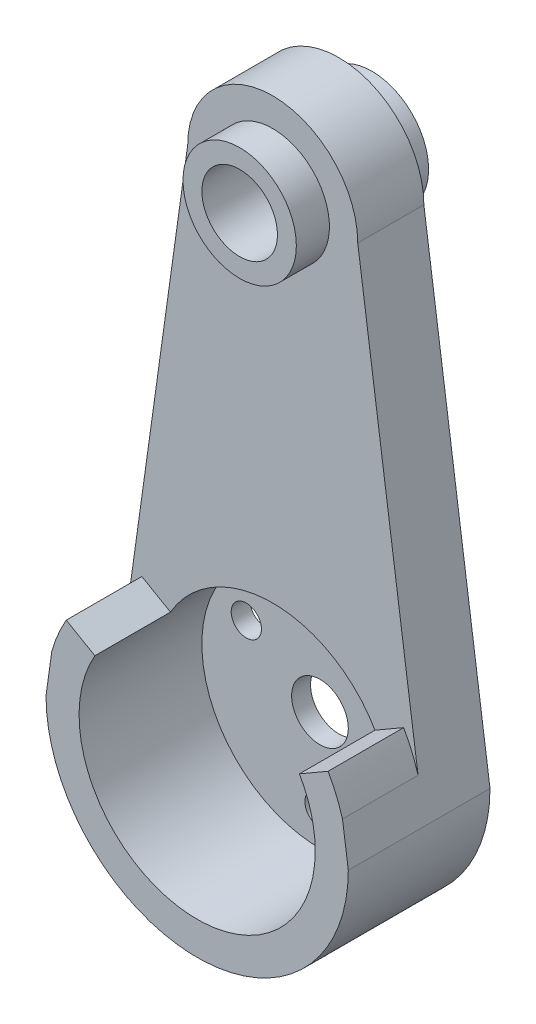
ISO-10303-21;
HEADER;
FILE_DESCRIPTION(('STEP AP214'),'2;1');
FILE_NAME('part.step','',(''),(''),'','','');
FILE_SCHEMA(('AUTOMOTIVE_DESIGN { 1 0 10303 214 1 1 1 1 }'));
ENDSEC;
DATA;
#1=APPLICATION_CONTEXT('core data for automotive mechanical design processes');
#2=APPLICATION_PROTOCOL_DEFINITION('international standard','automotive_design',2000,#1);
#3=PRODUCT_CONTEXT('',#1,'mechanical');
#4=PRODUCT('Part','Part','',(#3));
#5=PRODUCT_RELATED_PRODUCT_CATEGORY('part','',(#4));
#6=PRODUCT_DEFINITION_FORMATION('','',#4);
#7=PRODUCT_DEFINITION_CONTEXT('part definition',#1,'design');
#8=PRODUCT_DEFINITION('design','',#6,#7);
#9=PRODUCT_DEFINITION_SHAPE('','',#8);
#10=(LENGTH_UNIT() NAMED_UNIT(*) SI_UNIT(.MILLI.,.METRE.));
#11=(NAMED_UNIT(*) PLANE_ANGLE_UNIT() SI_UNIT($,.RADIAN.));
#12=(NAMED_UNIT(*) SI_UNIT($,.STERADIAN.) SOLID_ANGLE_UNIT());
#13=UNCERTAINTY_MEASURE_WITH_UNIT(LENGTH_MEASURE(1.E-05),#10,'distance_accuracy_value','');
#14=(GEOMETRIC_REPRESENTATION_CONTEXT(3) GLOBAL_UNCERTAINTY_ASSIGNED_CONTEXT((#13)) GLOBAL_UNIT_ASSIGNED_CONTEXT((#10,
#11,#12)) REPRESENTATION_CONTEXT('',''));
#15=CARTESIAN_POINT('',(0.,0.,0.));
#16=DIRECTION('',(0.,0.,1.));
#17=DIRECTION('',(1.,0.,0.));
#18=AXIS2_PLACEMENT_3D('',#15,#16,#17);
#19=CARTESIAN_POINT('',(0.,0.,7.));
#20=DIRECTION('',(0.,0.,-1.));
#21=DIRECTION('',(-1.,0.,0.));
#22=AXIS2_PLACEMENT_3D('',#19,#20,#21);
#23=PLANE('',#22);
#24=CARTESIAN_POINT('',(0.,0.,7.));
#25=DIRECTION('',(0.,0.,-1.));
#26=DIRECTION('',(-1.,0.,0.));
#27=AXIS2_PLACEMENT_3D('',#24,#25,#26);
#28=CIRCLE('',#27,6.);
#29=CARTESIAN_POINT('',(-6.,0.,7.));
#30=VERTEX_POINT('',#29);
#31=EDGE_CURVE('E11',#30,#30,#28,.F.);
#32=ORIENTED_EDGE('',*,*,#31,.F.);
#33=EDGE_LOOP('',(#32));
#34=FACE_BOUND('',#33,.T.);
#35=CARTESIAN_POINT('',(0.,-50.,7.));
#36=DIRECTION('',(0.,0.,1.));
#37=DIRECTION('',(1.,0.,0.));
#38=AXIS2_PLACEMENT_3D('',#35,#36,#37);
#39=CIRCLE('',#38,16.);
#40=CARTESIAN_POINT('',(15.3848568065908,-45.6061200470773,7.));
#41=VERTEX_POINT('',#40);
#42=CARTESIAN_POINT('',(13.8564064605511,-42.0000000000001,7.));
#43=VERTEX_POINT('',#42);
#44=EDGE_CURVE('E454',#41,#43,#39,.T.);
#45=ORIENTED_EDGE('',*,*,#44,.F.);
#46=DIRECTION('',(-0.138647844534406,0.99034174667433,0.));
#47=VECTOR('',#46,1.);
#48=CARTESIAN_POINT('',(9.,0.,7.));
#49=LINE('',#48,#47);
#50=CARTESIAN_POINT('',(9.,0.,7.));
#51=VERTEX_POINT('',#50);
#52=EDGE_CURVE('E65',#41,#51,#49,.T.);
#53=ORIENTED_EDGE('',*,*,#52,.T.);
#54=CARTESIAN_POINT('',(0.,0.,7.));
#55=DIRECTION('',(0.,0.,1.));
#56=DIRECTION('',(-1.,0.,0.));
#57=AXIS2_PLACEMENT_3D('',#54,#55,#56);
#58=CIRCLE('',#57,9.);
#59=CARTESIAN_POINT('',(-9.,0.,7.));
#60=VERTEX_POINT('',#59);
#61=EDGE_CURVE('E96',#51,#60,#58,.T.);
#62=ORIENTED_EDGE('',*,*,#61,.T.);
#63=DIRECTION('',(-0.138647844534406,-0.99034174667433,0.));
#64=VECTOR('',#63,1.);
#65=CARTESIAN_POINT('',(-9.,0.,7.));
#66=LINE('',#65,#64);
#67=CARTESIAN_POINT('',(-15.3848568065908,-45.6061200470774,7.));
#68=VERTEX_POINT('',#67);
#69=EDGE_CURVE('E155',#60,#68,#66,.T.);
#70=ORIENTED_EDGE('',*,*,#69,.T.);
#71=CARTESIAN_POINT('',(-13.8564064605511,-42.0000000000001,7.));
#72=VERTEX_POINT('',#71);
#73=EDGE_CURVE('E162',#72,#68,#39,.T.);
#74=ORIENTED_EDGE('',*,*,#73,.F.);
#75=DIRECTION('',(0.866025403784442,-0.499999999999994,0.));
#76=VECTOR('',#75,1.);
#77=CARTESIAN_POINT('',(-21.6506350946108,-37.5000000000003,7.));
#78=LINE('',#77,#76);
#79=CARTESIAN_POINT('',(-10.8253175473055,-43.7500000000001,7.));
#80=VERTEX_POINT('',#79);
#81=EDGE_CURVE('E185',#72,#80,#78,.T.);
#82=ORIENTED_EDGE('',*,*,#81,.T.);
#83=CARTESIAN_POINT('',(0.,-50.,7.));
#84=DIRECTION('',(0.,0.,1.));
#85=DIRECTION('',(1.,0.,0.));
#86=AXIS2_PLACEMENT_3D('',#83,#84,#85);
#87=CIRCLE('',#86,12.5);
#88=CARTESIAN_POINT('',(10.8253175473055,-43.7500000000001,7.));
#89=VERTEX_POINT('',#88);
#90=EDGE_CURVE('E131',#89,#80,#87,.T.);
#91=ORIENTED_EDGE('',*,*,#90,.F.);
#92=DIRECTION('',(0.866025403784441,0.499999999999996,0.));
#93=VECTOR('',#92,1.);
#94=CARTESIAN_POINT('',(21.6506350946108,-37.5000000000002,7.));
#95=LINE('',#94,#93);
#96=EDGE_CURVE('E56',#89,#43,#95,.T.);
#97=ORIENTED_EDGE('',*,*,#96,.T.);
#98=EDGE_LOOP('',(#45,#53,#62,#70,#74,#82,#91,#97));
#99=FACE_BOUND('',#98,.T.);
#100=ADVANCED_FACE('F41',(#34,#99),#23,.F.);
#101=CARTESIAN_POINT('',(0.,-50.,0.));
#102=DIRECTION('',(0.,0.,1.));
#103=DIRECTION('',(1.,0.,0.));
#104=AXIS2_PLACEMENT_3D('',#101,#102,#103);
#105=CYLINDRICAL_SURFACE('',#104,3.);
#106=CARTESIAN_POINT('',(0.,-50.,0.));
#107=DIRECTION('',(0.,0.,1.));
#108=DIRECTION('',(1.,0.,0.));
#109=AXIS2_PLACEMENT_3D('',#106,#107,#108);
#110=CIRCLE('',#109,3.);
#111=CARTESIAN_POINT('',(3.00000000000001,-50.,0.));
#112=VERTEX_POINT('',#111);
#113=EDGE_CURVE('E107',#112,#112,#110,.T.);
#114=ORIENTED_EDGE('',*,*,#113,.F.);
#115=EDGE_LOOP('',(#114));
#116=FACE_BOUND('',#115,.T.);
#117=CARTESIAN_POINT('',(0.,-50.,2.));
#118=DIRECTION('',(0.,0.,1.));
#119=DIRECTION('',(1.,0.,0.));
#120=AXIS2_PLACEMENT_3D('',#117,#118,#119);
#121=CIRCLE('',#120,3.);
#122=CARTESIAN_POINT('',(3.00000000000001,-50.,2.));
#123=VERTEX_POINT('',#122);
#124=EDGE_CURVE('E144',#123,#123,#121,.F.);
#125=ORIENTED_EDGE('',*,*,#124,.F.);
#126=EDGE_LOOP('',(#125));
#127=FACE_BOUND('',#126,.T.);
#128=ADVANCED_FACE('F225',(#116,#127),#105,.F.);
#129=CARTESIAN_POINT('',(7.79422863405995,-45.5,0.));
#130=DIRECTION('',(0.,0.,1.));
#131=DIRECTION('',(1.,0.,0.));
#132=AXIS2_PLACEMENT_3D('',#129,#130,#131);
#133=CYLINDRICAL_SURFACE('',#132,1.6);
#134=CARTESIAN_POINT('',(7.79422863405995,-45.5,0.));
#135=DIRECTION('',(0.,0.,1.));
#136=DIRECTION('',(1.,0.,0.));
#137=AXIS2_PLACEMENT_3D('',#134,#135,#136);
#138=CIRCLE('',#137,1.6);
#139=CARTESIAN_POINT('',(9.39422863405995,-45.5,0.));
#140=VERTEX_POINT('',#139);
#141=EDGE_CURVE('E147',#140,#140,#138,.T.);
#142=ORIENTED_EDGE('',*,*,#141,.F.);
#143=EDGE_LOOP('',(#142));
#144=FACE_BOUND('',#143,.T.);
#145=CARTESIAN_POINT('',(7.79422863405995,-45.5,2.));
#146=DIRECTION('',(0.,0.,1.));
#147=DIRECTION('',(1.,0.,0.));
#148=AXIS2_PLACEMENT_3D('',#145,#146,#147);
#149=CIRCLE('',#148,1.6);
#150=CARTESIAN_POINT('',(9.39422863405995,-45.5,2.));
#151=VERTEX_POINT('',#150);
#152=EDGE_CURVE('E128',#151,#151,#149,.F.);
#153=ORIENTED_EDGE('',*,*,#152,.F.);
#154=EDGE_LOOP('',(#153));
#155=FACE_BOUND('',#154,.T.);
#156=ADVANCED_FACE('F228',(#144,#155),#133,.F.);
#157=CARTESIAN_POINT('',(-7.7942286340599,-45.4999999999999,0.));
#158=DIRECTION('',(0.,0.,1.));
#159=DIRECTION('',(1.,0.,0.));
#160=AXIS2_PLACEMENT_3D('',#157,#158,#159);
#161=CYLINDRICAL_SURFACE('',#160,1.6);
#162=CARTESIAN_POINT('',(-7.7942286340599,-45.4999999999999,0.));
#163=DIRECTION('',(0.,0.,1.));
#164=DIRECTION('',(1.,0.,0.));
#165=AXIS2_PLACEMENT_3D('',#162,#163,#164);
#166=CIRCLE('',#165,1.6);
#167=CARTESIAN_POINT('',(-6.1942286340599,-45.4999999999999,0.));
#168=VERTEX_POINT('',#167);
#169=EDGE_CURVE('E150',#168,#168,#166,.T.);
#170=ORIENTED_EDGE('',*,*,#169,.F.);
#171=EDGE_LOOP('',(#170));
#172=FACE_BOUND('',#171,.T.);
#173=CARTESIAN_POINT('',(-7.7942286340599,-45.4999999999999,2.));
#174=DIRECTION('',(0.,0.,1.));
#175=DIRECTION('',(1.,0.,0.));
#176=AXIS2_PLACEMENT_3D('',#173,#174,#175);
#177=CIRCLE('',#176,1.6);
#178=CARTESIAN_POINT('',(-6.1942286340599,-45.4999999999999,2.));
#179=VERTEX_POINT('',#178);
#180=EDGE_CURVE('E123',#179,#179,#177,.F.);
#181=ORIENTED_EDGE('',*,*,#180,.F.);
#182=EDGE_LOOP('',(#181));
#183=FACE_BOUND('',#182,.T.);
#184=ADVANCED_FACE('F263',(#172,#183),#161,.F.);
#185=CARTESIAN_POINT('',(0.,-59.,0.));
#186=DIRECTION('',(0.,0.,1.));
#187=DIRECTION('',(1.,0.,0.));
#188=AXIS2_PLACEMENT_3D('',#185,#186,#187);
#189=CYLINDRICAL_SURFACE('',#188,1.6);
#190=CARTESIAN_POINT('',(0.,-59.,0.));
#191=DIRECTION('',(0.,0.,1.));
#192=DIRECTION('',(1.,0.,0.));
#193=AXIS2_PLACEMENT_3D('',#190,#191,#192);
#194=CIRCLE('',#193,1.6);
#195=CARTESIAN_POINT('',(1.6,-59.,0.));
#196=VERTEX_POINT('',#195);
#197=EDGE_CURVE('E111',#196,#196,#194,.T.);
#198=ORIENTED_EDGE('',*,*,#197,.F.);
#199=EDGE_LOOP('',(#198));
#200=FACE_BOUND('',#199,.T.);
#201=CARTESIAN_POINT('',(0.,-59.,2.));
#202=DIRECTION('',(0.,0.,1.));
#203=DIRECTION('',(1.,0.,0.));
#204=AXIS2_PLACEMENT_3D('',#201,#202,#203);
#205=CIRCLE('',#204,1.6);
#206=CARTESIAN_POINT('',(1.6,-59.,2.));
#207=VERTEX_POINT('',#206);
#208=EDGE_CURVE('E121',#207,#207,#205,.F.);
#209=ORIENTED_EDGE('',*,*,#208,.F.);
#210=EDGE_LOOP('',(#209));
#211=FACE_BOUND('',#210,.T.);
#212=ADVANCED_FACE('F259',(#200,#211),#189,.F.);
#213=CARTESIAN_POINT('',(0.,0.,7.));
#214=DIRECTION('',(0.,0.,-1.));
#215=DIRECTION('',(-1.,0.,0.));
#216=AXIS2_PLACEMENT_3D('',#213,#214,#215);
#217=CYLINDRICAL_SURFACE('',#216,9.);
#218=CARTESIAN_POINT('',(0.,0.,0.));
#219=DIRECTION('',(0.,0.,1.));
#220=DIRECTION('',(-1.,0.,0.));
#221=AXIS2_PLACEMENT_3D('',#218,#219,#220);
#222=CIRCLE('',#221,9.);
#223=CARTESIAN_POINT('',(9.,0.,0.));
#224=VERTEX_POINT('',#223);
#225=CARTESIAN_POINT('',(-9.,0.,0.));
#226=VERTEX_POINT('',#225);
#227=EDGE_CURVE('E102',#224,#226,#222,.T.);
#228=ORIENTED_EDGE('',*,*,#227,.T.);
#229=DIRECTION('',(0.,0.,-1.));
#230=VECTOR('',#229,1.);
#231=CARTESIAN_POINT('',(-9.,0.,7.));
#232=LINE('',#231,#230);
#233=EDGE_CURVE('E49',#60,#226,#232,.T.);
#234=ORIENTED_EDGE('',*,*,#233,.F.);
#235=ORIENTED_EDGE('',*,*,#61,.F.);
#236=DIRECTION('',(0.,0.,-1.));
#237=VECTOR('',#236,1.);
#238=CARTESIAN_POINT('',(9.,0.,7.));
#239=LINE('',#238,#237);
#240=EDGE_CURVE('E88',#51,#224,#239,.T.);
#241=ORIENTED_EDGE('',*,*,#240,.T.);
#242=EDGE_LOOP('',(#228,#234,#235,#241));
#243=FACE_BOUND('',#242,.T.);
#244=ADVANCED_FACE('F43',(#243),#217,.T.);
#245=CARTESIAN_POINT('',(-9.,0.,7.));
#246=DIRECTION('',(0.99034174667433,-0.138647844534406,0.));
#247=DIRECTION('',(0.138647844534406,0.99034174667433,0.));
#248=AXIS2_PLACEMENT_3D('',#245,#246,#247);
#249=PLANE('',#248);
#250=DIRECTION('',(-0.138647844534406,-0.99034174667433,0.));
#251=VECTOR('',#250,1.);
#252=CARTESIAN_POINT('',(-9.,0.,0.));
#253=LINE('',#252,#251);
#254=CARTESIAN_POINT('',(-16.,-50.,0.));
#255=VERTEX_POINT('',#254);
#256=EDGE_CURVE('E105',#226,#255,#253,.T.);
#257=ORIENTED_EDGE('',*,*,#256,.T.);
#258=DIRECTION('',(0.,0.,-1.));
#259=VECTOR('',#258,1.);
#260=CARTESIAN_POINT('',(-16.,-50.,7.));
#261=LINE('',#260,#259);
#262=CARTESIAN_POINT('',(-16.,-50.,15.));
#263=VERTEX_POINT('',#262);
#264=EDGE_CURVE('E118',#263,#255,#261,.T.);
#265=ORIENTED_EDGE('',*,*,#264,.F.);
#266=DIRECTION('',(-0.138647844534406,-0.99034174667433,0.));
#267=VECTOR('',#266,1.);
#268=CARTESIAN_POINT('',(-8.82699097685367,1.23577873675951,15.));
#269=LINE('',#268,#267);
#270=CARTESIAN_POINT('',(-15.3848568065908,-45.6061200470774,15.));
#271=VERTEX_POINT('',#270);
#272=EDGE_CURVE('E173',#271,#263,#269,.T.);
#273=ORIENTED_EDGE('',*,*,#272,.F.);
#274=DIRECTION('',(0.,0.,-1.));
#275=VECTOR('',#274,1.);
#276=CARTESIAN_POINT('',(-15.3848568065908,-45.6061200470774,15.));
#277=LINE('',#276,#275);
#278=EDGE_CURVE('E169',#271,#68,#277,.T.);
#279=ORIENTED_EDGE('',*,*,#278,.T.);
#280=ORIENTED_EDGE('',*,*,#69,.F.);
#281=ORIENTED_EDGE('',*,*,#233,.T.);
#282=EDGE_LOOP('',(#257,#265,#273,#279,#280,#281));
#283=FACE_BOUND('',#282,.T.);
#284=ADVANCED_FACE('F166',(#283),#249,.F.);
#285=CARTESIAN_POINT('',(0.,-50.,7.));
#286=DIRECTION('',(0.,0.,-1.));
#287=DIRECTION('',(-1.,0.,0.));
#288=AXIS2_PLACEMENT_3D('',#285,#286,#287);
#289=CYLINDRICAL_SURFACE('',#288,16.);
#290=CARTESIAN_POINT('',(0.,-50.,0.));
#291=DIRECTION('',(0.,0.,1.));
#292=DIRECTION('',(1.,0.,0.));
#293=AXIS2_PLACEMENT_3D('',#290,#291,#292);
#294=CIRCLE('',#293,16.);
#295=CARTESIAN_POINT('',(16.,-50.,0.));
#296=VERTEX_POINT('',#295);
#297=EDGE_CURVE('E97',#255,#296,#294,.T.);
#298=ORIENTED_EDGE('',*,*,#297,.T.);
#299=DIRECTION('',(0.,0.,-1.));
#300=VECTOR('',#299,1.);
#301=CARTESIAN_POINT('',(16.,-50.,7.));
#302=LINE('',#301,#300);
#303=CARTESIAN_POINT('',(16.,-50.,15.));
#304=VERTEX_POINT('',#303);
#305=EDGE_CURVE('E92',#304,#296,#302,.T.);
#306=ORIENTED_EDGE('',*,*,#305,.F.);
#307=CARTESIAN_POINT('',(0.,-50.,15.));
#308=DIRECTION('',(0.,0.,1.));
#309=DIRECTION('',(1.,0.,0.));
#310=AXIS2_PLACEMENT_3D('',#307,#308,#309);
#311=CIRCLE('',#310,16.);
#312=EDGE_CURVE('E177',#263,#304,#311,.T.);
#313=ORIENTED_EDGE('',*,*,#312,.F.);
#314=ORIENTED_EDGE('',*,*,#264,.T.);
#315=EDGE_LOOP('',(#298,#306,#313,#314));
#316=FACE_BOUND('',#315,.T.);
#317=ADVANCED_FACE('F252',(#316),#289,.T.);
#318=CARTESIAN_POINT('',(9.,0.,7.));
#319=DIRECTION('',(-0.99034174667433,-0.138647844534406,0.));
#320=DIRECTION('',(0.138647844534406,-0.99034174667433,0.));
#321=AXIS2_PLACEMENT_3D('',#318,#319,#320);
#322=PLANE('',#321);
#323=DIRECTION('',(-0.138647844534406,0.99034174667433,0.));
#324=VECTOR('',#323,1.);
#325=CARTESIAN_POINT('',(9.,0.,0.));
#326=LINE('',#325,#324);
#327=EDGE_CURVE('E85',#296,#224,#326,.T.);
#328=ORIENTED_EDGE('',*,*,#327,.T.);
#329=ORIENTED_EDGE('',*,*,#240,.F.);
#330=ORIENTED_EDGE('',*,*,#52,.F.);
#331=DIRECTION('',(0.,0.,-1.));
#332=VECTOR('',#331,1.);
#333=CARTESIAN_POINT('',(15.3848568065908,-45.6061200470773,15.));
#334=LINE('',#333,#332);
#335=CARTESIAN_POINT('',(15.3848568065908,-45.6061200470773,15.));
#336=VERTEX_POINT('',#335);
#337=EDGE_CURVE('E194',#336,#41,#334,.T.);
#338=ORIENTED_EDGE('',*,*,#337,.F.);
#339=DIRECTION('',(-0.138647844534406,0.99034174667433,0.));
#340=VECTOR('',#339,1.);
#341=CARTESIAN_POINT('',(8.82699097685367,1.23577873675951,15.));
#342=LINE('',#341,#340);
#343=EDGE_CURVE('E441',#304,#336,#342,.T.);
#344=ORIENTED_EDGE('',*,*,#343,.F.);
#345=ORIENTED_EDGE('',*,*,#305,.T.);
#346=EDGE_LOOP('',(#328,#329,#330,#338,#344,#345));
#347=FACE_BOUND('',#346,.T.);
#348=ADVANCED_FACE('F87',(#347),#322,.F.);
#349=CARTESIAN_POINT('',(0.,0.,0.));
#350=DIRECTION('',(0.,0.,-1.));
#351=DIRECTION('',(-1.,0.,0.));
#352=AXIS2_PLACEMENT_3D('',#349,#350,#351);
#353=PLANE('',#352);
#354=CARTESIAN_POINT('',(0.,0.,0.));
#355=DIRECTION('',(0.,0.,-1.));
#356=DIRECTION('',(-1.,0.,0.));
#357=AXIS2_PLACEMENT_3D('',#354,#355,#356);
#358=CIRCLE('',#357,6.);
#359=CARTESIAN_POINT('',(-6.,0.,0.));
#360=VERTEX_POINT('',#359);
#361=EDGE_CURVE('E139',#360,#360,#358,.T.);
#362=ORIENTED_EDGE('',*,*,#361,.F.);
#363=EDGE_LOOP('',(#362));
#364=FACE_BOUND('',#363,.T.);
#365=ORIENTED_EDGE('',*,*,#197,.T.);
#366=EDGE_LOOP('',(#365));
#367=FACE_BOUND('',#366,.T.);
#368=ORIENTED_EDGE('',*,*,#169,.T.);
#369=EDGE_LOOP('',(#368));
#370=FACE_BOUND('',#369,.T.);
#371=ORIENTED_EDGE('',*,*,#141,.T.);
#372=EDGE_LOOP('',(#371));
#373=FACE_BOUND('',#372,.T.);
#374=ORIENTED_EDGE('',*,*,#113,.T.);
#375=EDGE_LOOP('',(#374));
#376=FACE_BOUND('',#375,.T.);
#377=ORIENTED_EDGE('',*,*,#227,.F.);
#378=ORIENTED_EDGE('',*,*,#327,.F.);
#379=ORIENTED_EDGE('',*,*,#297,.F.);
#380=ORIENTED_EDGE('',*,*,#256,.F.);
#381=EDGE_LOOP('',(#377,#378,#379,#380));
#382=FACE_BOUND('',#381,.T.);
#383=ADVANCED_FACE('F104',(#364,#367,#370,#373,#376,#382),#353,.T.);
#384=CARTESIAN_POINT('',(0.,-50.,2.));
#385=DIRECTION('',(0.,0.,1.));
#386=DIRECTION('',(1.,0.,0.));
#387=AXIS2_PLACEMENT_3D('',#384,#385,#386);
#388=PLANE('',#387);
#389=CARTESIAN_POINT('',(0.,-50.,2.));
#390=DIRECTION('',(0.,0.,1.));
#391=DIRECTION('',(1.,0.,0.));
#392=AXIS2_PLACEMENT_3D('',#389,#390,#391);
#393=CIRCLE('',#392,12.5);
#394=CARTESIAN_POINT('',(12.5,-50.,2.));
#395=VERTEX_POINT('',#394);
#396=EDGE_CURVE('E124',#395,#395,#393,.T.);
#397=ORIENTED_EDGE('',*,*,#396,.T.);
#398=EDGE_LOOP('',(#397));
#399=FACE_BOUND('',#398,.T.);
#400=ORIENTED_EDGE('',*,*,#208,.T.);
#401=EDGE_LOOP('',(#400));
#402=FACE_BOUND('',#401,.T.);
#403=ORIENTED_EDGE('',*,*,#180,.T.);
#404=EDGE_LOOP('',(#403));
#405=FACE_BOUND('',#404,.T.);
#406=ORIENTED_EDGE('',*,*,#152,.T.);
#407=EDGE_LOOP('',(#406));
#408=FACE_BOUND('',#407,.T.);
#409=ORIENTED_EDGE('',*,*,#124,.T.);
#410=EDGE_LOOP('',(#409));
#411=FACE_BOUND('',#410,.T.);
#412=ADVANCED_FACE('F215',(#399,#402,#405,#408,#411),#388,.T.);
#413=CARTESIAN_POINT('',(0.,-50.,2.));
#414=DIRECTION('',(0.,0.,1.));
#415=DIRECTION('',(1.,0.,0.));
#416=AXIS2_PLACEMENT_3D('',#413,#414,#415);
#417=CYLINDRICAL_SURFACE('',#416,12.5);
#418=ORIENTED_EDGE('',*,*,#396,.F.);
#419=EDGE_LOOP('',(#418));
#420=FACE_BOUND('',#419,.T.);
#421=ORIENTED_EDGE('',*,*,#90,.T.);
#422=DIRECTION('',(0.,0.,-1.));
#423=VECTOR('',#422,1.);
#424=CARTESIAN_POINT('',(-10.8253175473055,-43.7500000000001,15.));
#425=LINE('',#424,#423);
#426=CARTESIAN_POINT('',(-10.8253175473055,-43.7500000000001,15.));
#427=VERTEX_POINT('',#426);
#428=EDGE_CURVE('E180',#427,#80,#425,.T.);
#429=ORIENTED_EDGE('',*,*,#428,.F.);
#430=CARTESIAN_POINT('',(0.,-50.,15.));
#431=DIRECTION('',(0.,0.,1.));
#432=DIRECTION('',(1.,0.,0.));
#433=AXIS2_PLACEMENT_3D('',#430,#431,#432);
#434=CIRCLE('',#433,12.5);
#435=CARTESIAN_POINT('',(10.8253175473055,-43.7500000000001,15.));
#436=VERTEX_POINT('',#435);
#437=EDGE_CURVE('E469',#436,#427,#434,.F.);
#438=ORIENTED_EDGE('',*,*,#437,.F.);
#439=DIRECTION('',(0.,0.,-1.));
#440=VECTOR('',#439,1.);
#441=CARTESIAN_POINT('',(10.8253175473055,-43.7500000000001,15.));
#442=LINE('',#441,#440);
#443=EDGE_CURVE('E190',#436,#89,#442,.T.);
#444=ORIENTED_EDGE('',*,*,#443,.T.);
#445=EDGE_LOOP('',(#421,#429,#438,#444));
#446=FACE_BOUND('',#445,.T.);
#447=ADVANCED_FACE('F233',(#420,#446),#417,.F.);
#448=CARTESIAN_POINT('',(0.,0.,-3.5));
#449=DIRECTION('',(0.,0.,-1.));
#450=DIRECTION('',(-1.,0.,0.));
#451=AXIS2_PLACEMENT_3D('',#448,#449,#450);
#452=PLANE('',#451);
#453=CARTESIAN_POINT('',(0.,0.,-3.5));
#454=DIRECTION('',(0.,0.,-1.));
#455=DIRECTION('',(-1.,0.,0.));
#456=AXIS2_PLACEMENT_3D('',#453,#454,#455);
#457=CIRCLE('',#456,6.);
#458=CARTESIAN_POINT('',(-6.,0.,-3.5));
#459=VERTEX_POINT('',#458);
#460=EDGE_CURVE('E136',#459,#459,#457,.T.);
#461=ORIENTED_EDGE('',*,*,#460,.T.);
#462=EDGE_LOOP('',(#461));
#463=FACE_BOUND('',#462,.T.);
#464=CARTESIAN_POINT('',(0.,0.,-3.5));
#465=DIRECTION('',(0.,0.,-1.));
#466=DIRECTION('',(-1.,0.,0.));
#467=AXIS2_PLACEMENT_3D('',#464,#465,#466);
#468=CIRCLE('',#467,4.);
#469=CARTESIAN_POINT('',(-4.,0.,-3.5));
#470=VERTEX_POINT('',#469);
#471=EDGE_CURVE('E203',#470,#470,#468,.T.);
#472=ORIENTED_EDGE('',*,*,#471,.F.);
#473=EDGE_LOOP('',(#472));
#474=FACE_BOUND('',#473,.T.);
#475=ADVANCED_FACE('F238',(#463,#474),#452,.T.);
#476=CARTESIAN_POINT('',(0.,0.,-3.5));
#477=DIRECTION('',(0.,0.,1.));
#478=DIRECTION('',(1.,0.,0.));
#479=AXIS2_PLACEMENT_3D('',#476,#477,#478);
#480=CYLINDRICAL_SURFACE('',#479,6.);
#481=ORIENTED_EDGE('',*,*,#460,.F.);
#482=EDGE_LOOP('',(#481));
#483=FACE_BOUND('',#482,.T.);
#484=ORIENTED_EDGE('',*,*,#361,.T.);
#485=EDGE_LOOP('',(#484));
#486=FACE_BOUND('',#485,.T.);
#487=ADVANCED_FACE('F211',(#483,#486),#480,.T.);
#488=CARTESIAN_POINT('',(0.,0.,-3.5));
#489=DIRECTION('',(0.,0.,1.));
#490=DIRECTION('',(1.,0.,0.));
#491=AXIS2_PLACEMENT_3D('',#488,#489,#490);
#492=CYLINDRICAL_SURFACE('',#491,4.);
#493=ORIENTED_EDGE('',*,*,#471,.T.);
#494=EDGE_LOOP('',(#493));
#495=FACE_BOUND('',#494,.T.);
#496=CARTESIAN_POINT('',(0.,0.,10.5));
#497=DIRECTION('',(0.,0.,1.));
#498=DIRECTION('',(1.,0.,0.));
#499=AXIS2_PLACEMENT_3D('',#496,#497,#498);
#500=CIRCLE('',#499,4.);
#501=CARTESIAN_POINT('',(4.,0.,10.5));
#502=VERTEX_POINT('',#501);
#503=EDGE_CURVE('E197',#502,#502,#500,.T.);
#504=ORIENTED_EDGE('',*,*,#503,.T.);
#505=EDGE_LOOP('',(#504));
#506=FACE_BOUND('',#505,.T.);
#507=ADVANCED_FACE('F319',(#495,#506),#492,.F.);
#508=CARTESIAN_POINT('',(0.,0.,10.5));
#509=DIRECTION('',(0.,0.,1.));
#510=DIRECTION('',(1.,0.,0.));
#511=AXIS2_PLACEMENT_3D('',#508,#509,#510);
#512=PLANE('',#511);
#513=CARTESIAN_POINT('',(0.,0.,10.5));
#514=DIRECTION('',(0.,0.,1.));
#515=DIRECTION('',(1.,0.,0.));
#516=AXIS2_PLACEMENT_3D('',#513,#514,#515);
#517=CIRCLE('',#516,6.);
#518=CARTESIAN_POINT('',(6.,0.,10.5));
#519=VERTEX_POINT('',#518);
#520=EDGE_CURVE('E200',#519,#519,#517,.T.);
#521=ORIENTED_EDGE('',*,*,#520,.T.);
#522=EDGE_LOOP('',(#521));
#523=FACE_BOUND('',#522,.T.);
#524=ORIENTED_EDGE('',*,*,#503,.F.);
#525=EDGE_LOOP('',(#524));
#526=FACE_BOUND('',#525,.T.);
#527=ADVANCED_FACE('F326',(#523,#526),#512,.T.);
#528=CARTESIAN_POINT('',(0.,0.,10.5));
#529=DIRECTION('',(0.,0.,-1.));
#530=DIRECTION('',(-1.,0.,0.));
#531=AXIS2_PLACEMENT_3D('',#528,#529,#530);
#532=CYLINDRICAL_SURFACE('',#531,6.);
#533=ORIENTED_EDGE('',*,*,#520,.F.);
#534=EDGE_LOOP('',(#533));
#535=FACE_BOUND('',#534,.T.);
#536=ORIENTED_EDGE('',*,*,#31,.T.);
#537=EDGE_LOOP('',(#536));
#538=FACE_BOUND('',#537,.T.);
#539=ADVANCED_FACE('F331',(#535,#538),#532,.T.);
#540=CARTESIAN_POINT('',(0.,-50.,15.));
#541=DIRECTION('',(0.,0.,-1.));
#542=DIRECTION('',(-1.,0.,0.));
#543=AXIS2_PLACEMENT_3D('',#540,#541,#542);
#544=CYLINDRICAL_SURFACE('',#543,16.);
#545=ORIENTED_EDGE('',*,*,#44,.T.);
#546=DIRECTION('',(0.,0.,-1.));
#547=VECTOR('',#546,1.);
#548=CARTESIAN_POINT('',(13.8564064605511,-42.0000000000001,15.));
#549=LINE('',#548,#547);
#550=CARTESIAN_POINT('',(13.8564064605511,-42.0000000000001,15.));
#551=VERTEX_POINT('',#550);
#552=EDGE_CURVE('E192',#551,#43,#549,.T.);
#553=ORIENTED_EDGE('',*,*,#552,.F.);
#554=CARTESIAN_POINT('',(0.,-50.,15.));
#555=DIRECTION('',(0.,0.,1.));
#556=DIRECTION('',(1.,0.,0.));
#557=AXIS2_PLACEMENT_3D('',#554,#555,#556);
#558=CIRCLE('',#557,16.);
#559=EDGE_CURVE('E446',#336,#551,#558,.T.);
#560=ORIENTED_EDGE('',*,*,#559,.F.);
#561=ORIENTED_EDGE('',*,*,#337,.T.);
#562=EDGE_LOOP('',(#545,#553,#560,#561));
#563=FACE_BOUND('',#562,.T.);
#564=ADVANCED_FACE('F340',(#563),#544,.T.);
#565=CARTESIAN_POINT('',(21.6506350946108,-37.5000000000002,15.));
#566=DIRECTION('',(-0.499999999999996,0.866025403784441,0.));
#567=DIRECTION('',(-0.866025403784441,-0.499999999999996,0.));
#568=AXIS2_PLACEMENT_3D('',#565,#566,#567);
#569=PLANE('',#568);
#570=ORIENTED_EDGE('',*,*,#96,.F.);
#571=ORIENTED_EDGE('',*,*,#443,.F.);
#572=DIRECTION('',(0.866025403784441,0.499999999999996,0.));
#573=VECTOR('',#572,1.);
#574=CARTESIAN_POINT('',(21.6506350946108,-37.5000000000002,15.));
#575=LINE('',#574,#573);
#576=EDGE_CURVE('E471',#436,#551,#575,.T.);
#577=ORIENTED_EDGE('',*,*,#576,.T.);
#578=ORIENTED_EDGE('',*,*,#552,.T.);
#579=EDGE_LOOP('',(#570,#571,#577,#578));
#580=FACE_BOUND('',#579,.T.);
#581=ADVANCED_FACE('F380',(#580),#569,.T.);
#582=CARTESIAN_POINT('',(-21.6506350946108,-37.5000000000003,15.));
#583=DIRECTION('',(0.499999999999994,0.866025403784442,0.));
#584=DIRECTION('',(-0.866025403784442,0.499999999999994,0.));
#585=AXIS2_PLACEMENT_3D('',#582,#583,#584);
#586=PLANE('',#585);
#587=ORIENTED_EDGE('',*,*,#81,.F.);
#588=DIRECTION('',(0.,0.,-1.));
#589=VECTOR('',#588,1.);
#590=CARTESIAN_POINT('',(-13.8564064605511,-42.0000000000001,15.));
#591=LINE('',#590,#589);
#592=CARTESIAN_POINT('',(-13.8564064605511,-42.0000000000001,15.));
#593=VERTEX_POINT('',#592);
#594=EDGE_CURVE('E176',#593,#72,#591,.T.);
#595=ORIENTED_EDGE('',*,*,#594,.F.);
#596=DIRECTION('',(0.866025403784442,-0.499999999999994,0.));
#597=VECTOR('',#596,1.);
#598=CARTESIAN_POINT('',(-21.6506350946108,-37.5000000000003,15.));
#599=LINE('',#598,#597);
#600=EDGE_CURVE('E486',#593,#427,#599,.T.);
#601=ORIENTED_EDGE('',*,*,#600,.T.);
#602=ORIENTED_EDGE('',*,*,#428,.T.);
#603=EDGE_LOOP('',(#587,#595,#601,#602));
#604=FACE_BOUND('',#603,.T.);
#605=ADVANCED_FACE('F391',(#604),#586,.T.);
#606=ORIENTED_EDGE('',*,*,#73,.T.);
#607=ORIENTED_EDGE('',*,*,#278,.F.);
#608=EDGE_CURVE('E484',#593,#271,#558,.T.);
#609=ORIENTED_EDGE('',*,*,#608,.F.);
#610=ORIENTED_EDGE('',*,*,#594,.T.);
#611=EDGE_LOOP('',(#606,#607,#609,#610));
#612=FACE_BOUND('',#611,.T.);
#613=ADVANCED_FACE('F383',(#612),#544,.T.);
#614=CARTESIAN_POINT('',(0.,0.,15.));
#615=DIRECTION('',(0.,0.,1.));
#616=DIRECTION('',(1.,0.,0.));
#617=AXIS2_PLACEMENT_3D('',#614,#615,#616);
#618=PLANE('',#617);
#619=ORIENTED_EDGE('',*,*,#343,.T.);
#620=ORIENTED_EDGE('',*,*,#559,.T.);
#621=ORIENTED_EDGE('',*,*,#576,.F.);
#622=ORIENTED_EDGE('',*,*,#437,.T.);
#623=ORIENTED_EDGE('',*,*,#600,.F.);
#624=ORIENTED_EDGE('',*,*,#608,.T.);
#625=ORIENTED_EDGE('',*,*,#272,.T.);
#626=ORIENTED_EDGE('',*,*,#312,.T.);
#627=EDGE_LOOP('',(#619,#620,#621,#622,#623,#624,#625,#626));
#628=FACE_BOUND('',#627,.T.);
#629=ADVANCED_FACE('F409',(#628),#618,.T.);
#630=CLOSED_SHELL('',(#100,#128,#156,#184,#212,#244,#284,#317,#348,#383,#412,#447,#475,#487,
#507,#527,#539,#564,#581,#605,#613,#629));
#631=MANIFOLD_SOLID_BREP('B2',#630);
#632=ADVANCED_BREP_SHAPE_REPRESENTATION('',(#18,#631),#14);
#633=SHAPE_DEFINITION_REPRESENTATION(#9,#632);
ENDSEC;
END-ISO-10303-21;
